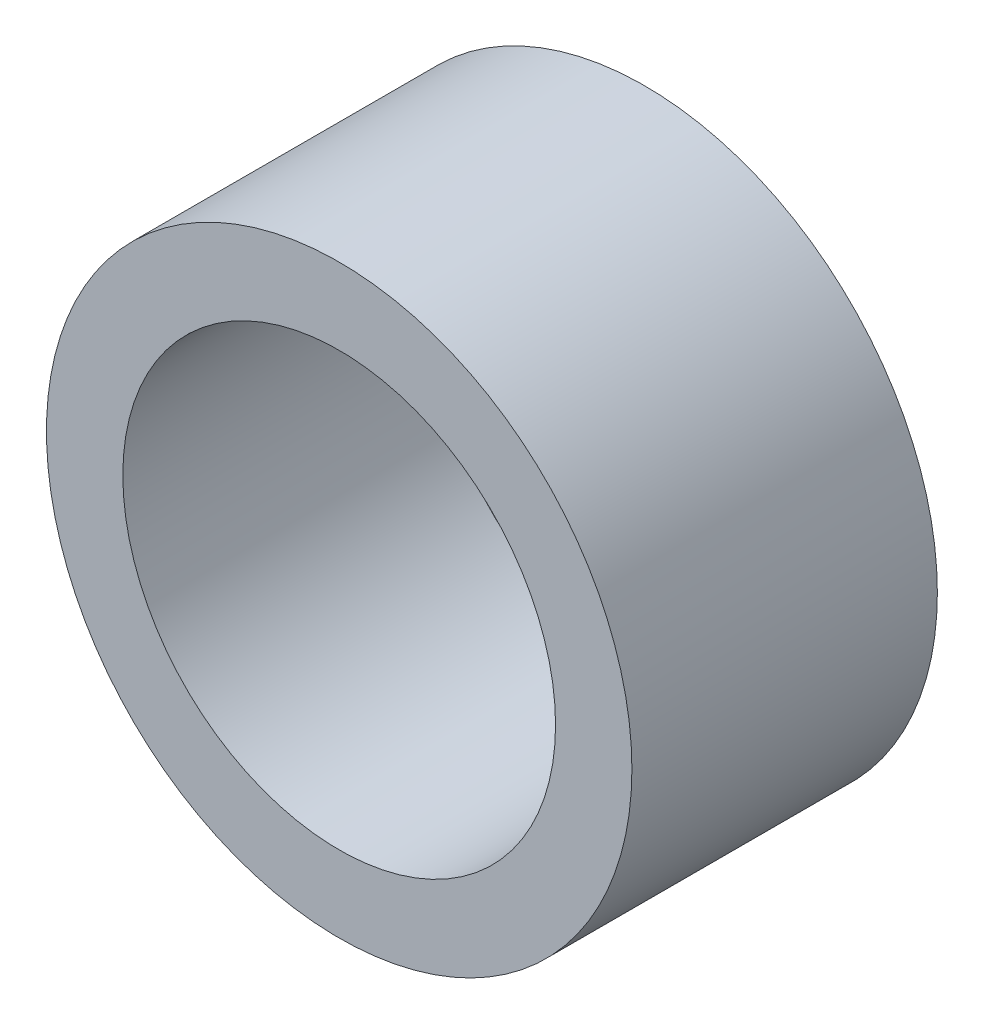
ISO-10303-21;
HEADER;
FILE_DESCRIPTION(('STEP AP214'),'2;1');
FILE_NAME('part.step','',(''),(''),'','','');
FILE_SCHEMA(('AUTOMOTIVE_DESIGN { 1 0 10303 214 1 1 1 1 }'));
ENDSEC;
DATA;
#1=APPLICATION_CONTEXT('core data for automotive mechanical design processes');
#2=APPLICATION_PROTOCOL_DEFINITION('international standard','automotive_design',2000,#1);
#3=PRODUCT_CONTEXT('',#1,'mechanical');
#4=PRODUCT('Part','Part','',(#3));
#5=PRODUCT_RELATED_PRODUCT_CATEGORY('part','',(#4));
#6=PRODUCT_DEFINITION_FORMATION('','',#4);
#7=PRODUCT_DEFINITION_CONTEXT('part definition',#1,'design');
#8=PRODUCT_DEFINITION('design','',#6,#7);
#9=PRODUCT_DEFINITION_SHAPE('','',#8);
#10=(LENGTH_UNIT() NAMED_UNIT(*) SI_UNIT(.MILLI.,.METRE.));
#11=(NAMED_UNIT(*) PLANE_ANGLE_UNIT() SI_UNIT($,.RADIAN.));
#12=(NAMED_UNIT(*) SI_UNIT($,.STERADIAN.) SOLID_ANGLE_UNIT());
#13=UNCERTAINTY_MEASURE_WITH_UNIT(LENGTH_MEASURE(1.E-05),#10,'distance_accuracy_value','');
#14=(GEOMETRIC_REPRESENTATION_CONTEXT(3) GLOBAL_UNCERTAINTY_ASSIGNED_CONTEXT((#13)) GLOBAL_UNIT_ASSIGNED_CONTEXT((#10,
#11,#12)) REPRESENTATION_CONTEXT('',''));
#15=CARTESIAN_POINT('',(0.,0.,0.));
#16=DIRECTION('',(0.,0.,1.));
#17=DIRECTION('',(1.,0.,0.));
#18=AXIS2_PLACEMENT_3D('',#15,#16,#17);
#19=CARTESIAN_POINT('',(0.,0.,52.5));
#20=DIRECTION('',(0.,0.,1.));
#21=DIRECTION('',(1.,0.,0.));
#22=AXIS2_PLACEMENT_3D('',#19,#20,#21);
#23=PLANE('',#22);
#24=CARTESIAN_POINT('',(0.,0.,52.5));
#25=DIRECTION('',(0.,0.,1.));
#26=DIRECTION('',(1.,0.,0.));
#27=AXIS2_PLACEMENT_3D('',#24,#25,#26);
#28=CIRCLE('',#27,11.5);
#29=CARTESIAN_POINT('',(11.5,0.,52.5));
#30=VERTEX_POINT('',#29);
#31=EDGE_CURVE('E10',#30,#30,#28,.T.);
#32=ORIENTED_EDGE('',*,*,#31,.T.);
#33=EDGE_LOOP('',(#32));
#34=FACE_BOUND('',#33,.T.);
#35=CARTESIAN_POINT('',(0.,0.,52.5));
#36=DIRECTION('',(0.,0.,1.));
#37=DIRECTION('',(1.,0.,0.));
#38=AXIS2_PLACEMENT_3D('',#35,#36,#37);
#39=CIRCLE('',#38,8.5);
#40=CARTESIAN_POINT('',(8.5,0.,52.5));
#41=VERTEX_POINT('',#40);
#42=EDGE_CURVE('E50',#41,#41,#39,.T.);
#43=ORIENTED_EDGE('',*,*,#42,.F.);
#44=EDGE_LOOP('',(#43));
#45=FACE_BOUND('',#44,.T.);
#46=ADVANCED_FACE('F36',(#34,#45),#23,.T.);
#47=CARTESIAN_POINT('',(0.,0.,40.5));
#48=DIRECTION('',(0.,0.,1.));
#49=DIRECTION('',(1.,0.,0.));
#50=AXIS2_PLACEMENT_3D('',#47,#48,#49);
#51=PLANE('',#50);
#52=CARTESIAN_POINT('',(0.,0.,40.5));
#53=DIRECTION('',(0.,0.,1.));
#54=DIRECTION('',(1.,0.,0.));
#55=AXIS2_PLACEMENT_3D('',#52,#53,#54);
#56=CIRCLE('',#55,11.5);
#57=CARTESIAN_POINT('',(11.5,0.,40.5));
#58=VERTEX_POINT('',#57);
#59=EDGE_CURVE('E40',#58,#58,#56,.T.);
#60=ORIENTED_EDGE('',*,*,#59,.F.);
#61=EDGE_LOOP('',(#60));
#62=FACE_BOUND('',#61,.T.);
#63=CARTESIAN_POINT('',(0.,0.,40.5));
#64=DIRECTION('',(0.,0.,1.));
#65=DIRECTION('',(1.,0.,0.));
#66=AXIS2_PLACEMENT_3D('',#63,#64,#65);
#67=CIRCLE('',#66,8.5);
#68=CARTESIAN_POINT('',(8.5,0.,40.5));
#69=VERTEX_POINT('',#68);
#70=EDGE_CURVE('E52',#69,#69,#67,.T.);
#71=ORIENTED_EDGE('',*,*,#70,.T.);
#72=EDGE_LOOP('',(#71));
#73=FACE_BOUND('',#72,.T.);
#74=ADVANCED_FACE('F63',(#62,#73),#51,.F.);
#75=CARTESIAN_POINT('',(0.,0.,52.5));
#76=DIRECTION('',(0.,0.,-1.));
#77=DIRECTION('',(-1.,0.,0.));
#78=AXIS2_PLACEMENT_3D('',#75,#76,#77);
#79=CYLINDRICAL_SURFACE('',#78,11.5);
#80=ORIENTED_EDGE('',*,*,#31,.F.);
#81=EDGE_LOOP('',(#80));
#82=FACE_BOUND('',#81,.T.);
#83=ORIENTED_EDGE('',*,*,#59,.T.);
#84=EDGE_LOOP('',(#83));
#85=FACE_BOUND('',#84,.T.);
#86=ADVANCED_FACE('F38',(#82,#85),#79,.T.);
#87=CARTESIAN_POINT('',(0.,0.,52.5));
#88=DIRECTION('',(0.,0.,-1.));
#89=DIRECTION('',(-1.,0.,0.));
#90=AXIS2_PLACEMENT_3D('',#87,#88,#89);
#91=CYLINDRICAL_SURFACE('',#90,8.5);
#92=ORIENTED_EDGE('',*,*,#42,.T.);
#93=EDGE_LOOP('',(#92));
#94=FACE_BOUND('',#93,.T.);
#95=ORIENTED_EDGE('',*,*,#70,.F.);
#96=EDGE_LOOP('',(#95));
#97=FACE_BOUND('',#96,.T.);
#98=ADVANCED_FACE('F59',(#94,#97),#91,.F.);
#99=CLOSED_SHELL('',(#46,#74,#86,#98));
#100=MANIFOLD_SOLID_BREP('B2',#99);
#101=ADVANCED_BREP_SHAPE_REPRESENTATION('',(#18,#100),#14);
#102=SHAPE_DEFINITION_REPRESENTATION(#9,#101);
ENDSEC;
END-ISO-10303-21;
